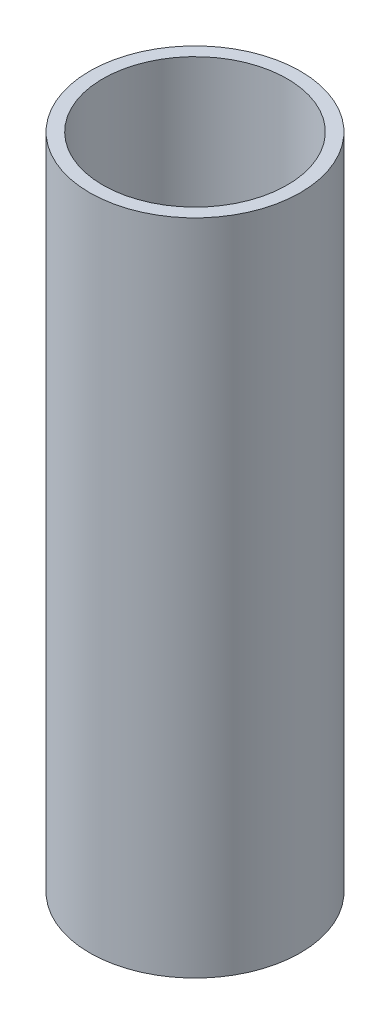
ISO-10303-21;
HEADER;
FILE_DESCRIPTION(('STEP AP214'),'2;1');
FILE_NAME('part.step','',(''),(''),'','','');
FILE_SCHEMA(('AUTOMOTIVE_DESIGN { 1 0 10303 214 1 1 1 1 }'));
ENDSEC;
DATA;
#1=APPLICATION_CONTEXT('core data for automotive mechanical design processes');
#2=APPLICATION_PROTOCOL_DEFINITION('international standard','automotive_design',2000,#1);
#3=PRODUCT_CONTEXT('',#1,'mechanical');
#4=PRODUCT('Part','Part','',(#3));
#5=PRODUCT_RELATED_PRODUCT_CATEGORY('part','',(#4));
#6=PRODUCT_DEFINITION_FORMATION('','',#4);
#7=PRODUCT_DEFINITION_CONTEXT('part definition',#1,'design');
#8=PRODUCT_DEFINITION('design','',#6,#7);
#9=PRODUCT_DEFINITION_SHAPE('','',#8);
#10=(LENGTH_UNIT() NAMED_UNIT(*) SI_UNIT(.MILLI.,.METRE.));
#11=(NAMED_UNIT(*) PLANE_ANGLE_UNIT() SI_UNIT($,.RADIAN.));
#12=(NAMED_UNIT(*) SI_UNIT($,.STERADIAN.) SOLID_ANGLE_UNIT());
#13=UNCERTAINTY_MEASURE_WITH_UNIT(LENGTH_MEASURE(1.E-05),#10,'distance_accuracy_value','');
#14=(GEOMETRIC_REPRESENTATION_CONTEXT(3) GLOBAL_UNCERTAINTY_ASSIGNED_CONTEXT((#13)) GLOBAL_UNIT_ASSIGNED_CONTEXT((#10,
#11,#12)) REPRESENTATION_CONTEXT('',''));
#15=CARTESIAN_POINT('',(0.,0.,0.));
#16=DIRECTION('',(0.,0.,1.));
#17=DIRECTION('',(1.,0.,0.));
#18=AXIS2_PLACEMENT_3D('',#15,#16,#17);
#19=CARTESIAN_POINT('',(0.,50.,0.));
#20=DIRECTION('',(0.,1.,0.));
#21=DIRECTION('',(0.,0.,1.));
#22=AXIS2_PLACEMENT_3D('',#19,#20,#21);
#23=PLANE('',#22);
#24=CARTESIAN_POINT('',(0.,50.,0.));
#25=DIRECTION('',(0.,1.,0.));
#26=DIRECTION('',(0.,0.,1.));
#27=AXIS2_PLACEMENT_3D('',#24,#25,#26);
#28=CIRCLE('',#27,8.);
#29=CARTESIAN_POINT('',(0.,50.,8.));
#30=VERTEX_POINT('',#29);
#31=EDGE_CURVE('E10',#30,#30,#28,.T.);
#32=ORIENTED_EDGE('',*,*,#31,.T.);
#33=EDGE_LOOP('',(#32));
#34=FACE_BOUND('',#33,.T.);
#35=CARTESIAN_POINT('',(0.,50.,0.));
#36=DIRECTION('',(0.,1.,0.));
#37=DIRECTION('',(0.,0.,1.));
#38=AXIS2_PLACEMENT_3D('',#35,#36,#37);
#39=CIRCLE('',#38,7.);
#40=CARTESIAN_POINT('',(0.,50.,7.));
#41=VERTEX_POINT('',#40);
#42=EDGE_CURVE('E44',#41,#41,#39,.T.);
#43=ORIENTED_EDGE('',*,*,#42,.F.);
#44=EDGE_LOOP('',(#43));
#45=FACE_BOUND('',#44,.T.);
#46=ADVANCED_FACE('F33',(#34,#45),#23,.T.);
#47=CARTESIAN_POINT('',(0.,0.,0.));
#48=DIRECTION('',(0.,1.,0.));
#49=DIRECTION('',(0.,0.,1.));
#50=AXIS2_PLACEMENT_3D('',#47,#48,#49);
#51=PLANE('',#50);
#52=CARTESIAN_POINT('',(0.,0.,0.));
#53=DIRECTION('',(0.,1.,0.));
#54=DIRECTION('',(0.,0.,1.));
#55=AXIS2_PLACEMENT_3D('',#52,#53,#54);
#56=CIRCLE('',#55,8.);
#57=CARTESIAN_POINT('',(0.,0.,8.));
#58=VERTEX_POINT('',#57);
#59=EDGE_CURVE('E37',#58,#58,#56,.T.);
#60=ORIENTED_EDGE('',*,*,#59,.F.);
#61=EDGE_LOOP('',(#60));
#62=FACE_BOUND('',#61,.T.);
#63=CARTESIAN_POINT('',(0.,0.,0.));
#64=DIRECTION('',(0.,1.,0.));
#65=DIRECTION('',(0.,0.,1.));
#66=AXIS2_PLACEMENT_3D('',#63,#64,#65);
#67=CIRCLE('',#66,7.);
#68=CARTESIAN_POINT('',(0.,0.,7.));
#69=VERTEX_POINT('',#68);
#70=EDGE_CURVE('E46',#69,#69,#67,.T.);
#71=ORIENTED_EDGE('',*,*,#70,.T.);
#72=EDGE_LOOP('',(#71));
#73=FACE_BOUND('',#72,.T.);
#74=ADVANCED_FACE('F56',(#62,#73),#51,.F.);
#75=CARTESIAN_POINT('',(0.,50.,0.));
#76=DIRECTION('',(0.,-1.,0.));
#77=DIRECTION('',(0.,0.,-1.));
#78=AXIS2_PLACEMENT_3D('',#75,#76,#77);
#79=CYLINDRICAL_SURFACE('',#78,8.);
#80=ORIENTED_EDGE('',*,*,#31,.F.);
#81=EDGE_LOOP('',(#80));
#82=FACE_BOUND('',#81,.T.);
#83=ORIENTED_EDGE('',*,*,#59,.T.);
#84=EDGE_LOOP('',(#83));
#85=FACE_BOUND('',#84,.T.);
#86=ADVANCED_FACE('F35',(#82,#85),#79,.T.);
#87=CARTESIAN_POINT('',(0.,50.,0.));
#88=DIRECTION('',(0.,-1.,0.));
#89=DIRECTION('',(0.,0.,-1.));
#90=AXIS2_PLACEMENT_3D('',#87,#88,#89);
#91=CYLINDRICAL_SURFACE('',#90,7.);
#92=ORIENTED_EDGE('',*,*,#42,.T.);
#93=EDGE_LOOP('',(#92));
#94=FACE_BOUND('',#93,.T.);
#95=ORIENTED_EDGE('',*,*,#70,.F.);
#96=EDGE_LOOP('',(#95));
#97=FACE_BOUND('',#96,.T.);
#98=ADVANCED_FACE('F52',(#94,#97),#91,.F.);
#99=CLOSED_SHELL('',(#46,#74,#86,#98));
#100=MANIFOLD_SOLID_BREP('B2',#99);
#101=ADVANCED_BREP_SHAPE_REPRESENTATION('',(#18,#100),#14);
#102=SHAPE_DEFINITION_REPRESENTATION(#9,#101);
ENDSEC;
END-ISO-10303-21;
